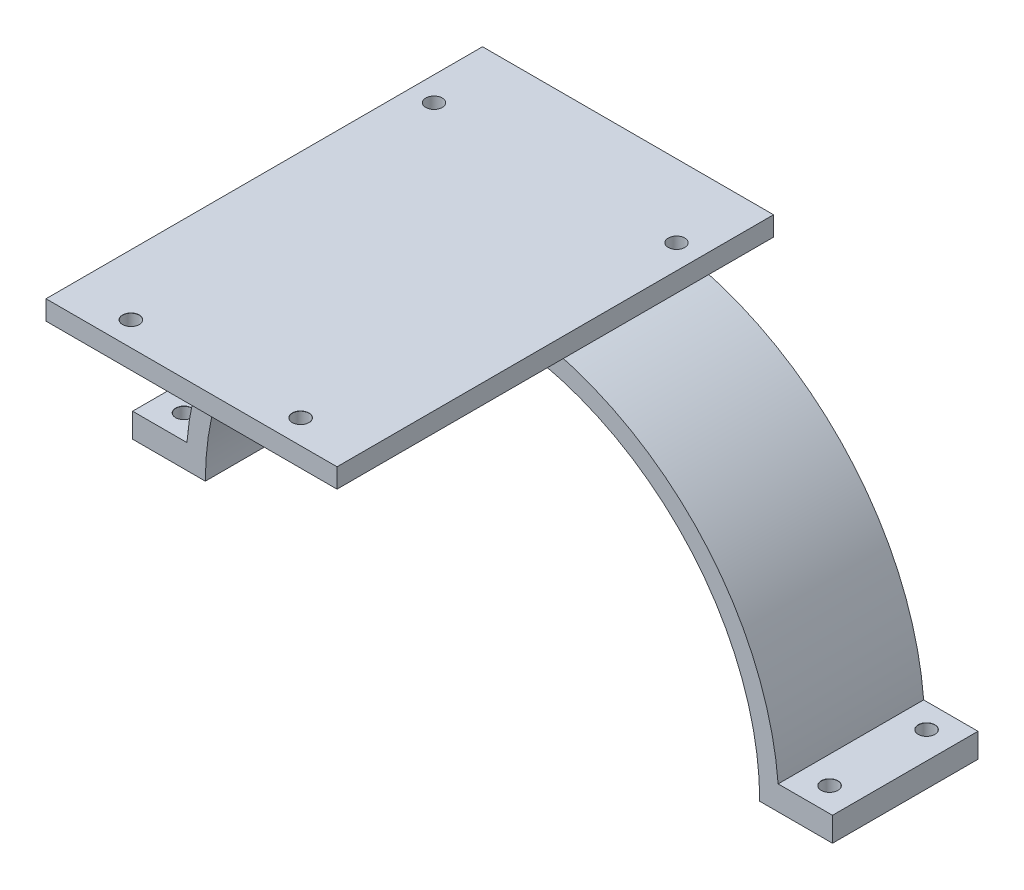
ISO-10303-21;
HEADER;
FILE_DESCRIPTION(('STEP AP214'),'2;1');
FILE_NAME('part.step','',(''),(''),'','','');
FILE_SCHEMA(('AUTOMOTIVE_DESIGN { 1 0 10303 214 1 1 1 1 }'));
ENDSEC;
DATA;
#1=APPLICATION_CONTEXT('core data for automotive mechanical design processes');
#2=APPLICATION_PROTOCOL_DEFINITION('international standard','automotive_design',2000,#1);
#3=PRODUCT_CONTEXT('',#1,'mechanical');
#4=PRODUCT('Part','Part','',(#3));
#5=PRODUCT_RELATED_PRODUCT_CATEGORY('part','',(#4));
#6=PRODUCT_DEFINITION_FORMATION('','',#4);
#7=PRODUCT_DEFINITION_CONTEXT('part definition',#1,'design');
#8=PRODUCT_DEFINITION('design','',#6,#7);
#9=PRODUCT_DEFINITION_SHAPE('','',#8);
#10=(LENGTH_UNIT() NAMED_UNIT(*) SI_UNIT(.MILLI.,.METRE.));
#11=(NAMED_UNIT(*) PLANE_ANGLE_UNIT() SI_UNIT($,.RADIAN.));
#12=(NAMED_UNIT(*) SI_UNIT($,.STERADIAN.) SOLID_ANGLE_UNIT());
#13=UNCERTAINTY_MEASURE_WITH_UNIT(LENGTH_MEASURE(1.E-05),#10,'distance_accuracy_value','');
#14=(GEOMETRIC_REPRESENTATION_CONTEXT(3) GLOBAL_UNCERTAINTY_ASSIGNED_CONTEXT((#13)) GLOBAL_UNIT_ASSIGNED_CONTEXT((#10,
#11,#12)) REPRESENTATION_CONTEXT('',''));
#15=CARTESIAN_POINT('',(0.,0.,0.));
#16=DIRECTION('',(0.,0.,1.));
#17=DIRECTION('',(1.,0.,0.));
#18=AXIS2_PLACEMENT_3D('',#15,#16,#17);
#19=CARTESIAN_POINT('',(0.,0.,30.));
#20=DIRECTION('',(0.,0.,-1.));
#21=DIRECTION('',(-1.,0.,0.));
#22=AXIS2_PLACEMENT_3D('',#19,#20,#21);
#23=CYLINDRICAL_SURFACE('',#22,61.15);
#24=CARTESIAN_POINT('',(0.,0.,30.));
#25=DIRECTION('',(0.,0.,1.));
#26=DIRECTION('',(-1.,0.,0.));
#27=AXIS2_PLACEMENT_3D('',#24,#25,#26);
#28=CIRCLE('',#27,61.15);
#29=CARTESIAN_POINT('',(-15.,59.2817214662327,30.));
#30=VERTEX_POINT('',#29);
#31=CARTESIAN_POINT('',(-60.9452418159121,5.,30.));
#32=VERTEX_POINT('',#31);
#33=EDGE_CURVE('E373',#30,#32,#28,.T.);
#34=ORIENTED_EDGE('',*,*,#33,.F.);
#35=DIRECTION('',(0.,0.,-1.));
#36=VECTOR('',#35,1.);
#37=CARTESIAN_POINT('',(-15.,59.2817214662327,30.));
#38=LINE('',#37,#36);
#39=CARTESIAN_POINT('',(-15.,59.2817214662327,0.));
#40=VERTEX_POINT('',#39);
#41=EDGE_CURVE('E261',#30,#40,#38,.T.);
#42=ORIENTED_EDGE('',*,*,#41,.T.);
#43=CARTESIAN_POINT('',(0.,0.,0.));
#44=DIRECTION('',(0.,0.,1.));
#45=DIRECTION('',(-1.,0.,0.));
#46=AXIS2_PLACEMENT_3D('',#43,#44,#45);
#47=CIRCLE('',#46,61.15);
#48=CARTESIAN_POINT('',(-60.9452418159121,5.,0.));
#49=VERTEX_POINT('',#48);
#50=EDGE_CURVE('E385',#40,#49,#47,.T.);
#51=ORIENTED_EDGE('',*,*,#50,.T.);
#52=DIRECTION('',(0.,0.,-1.));
#53=VECTOR('',#52,1.);
#54=CARTESIAN_POINT('',(-60.9452418159121,5.,30.));
#55=LINE('',#54,#53);
#56=EDGE_CURVE('E358',#49,#32,#55,.F.);
#57=ORIENTED_EDGE('',*,*,#56,.T.);
#58=EDGE_LOOP('',(#34,#42,#51,#57));
#59=FACE_BOUND('',#58,.T.);
#60=ADVANCED_FACE('F43',(#59),#23,.T.);
#61=CARTESIAN_POINT('',(0.,0.,30.));
#62=DIRECTION('',(0.,0.,-1.));
#63=DIRECTION('',(-1.,0.,0.));
#64=AXIS2_PLACEMENT_3D('',#61,#62,#63);
#65=CYLINDRICAL_SURFACE('',#64,57.15);
#66=CARTESIAN_POINT('',(0.,0.,0.));
#67=DIRECTION('',(0.,0.,-1.));
#68=DIRECTION('',(-1.,0.,0.));
#69=AXIS2_PLACEMENT_3D('',#66,#67,#68);
#70=CIRCLE('',#69,57.15);
#71=CARTESIAN_POINT('',(-57.15,0.,0.));
#72=VERTEX_POINT('',#71);
#73=CARTESIAN_POINT('',(57.15,0.,0.));
#74=VERTEX_POINT('',#73);
#75=EDGE_CURVE('E365',#72,#74,#70,.T.);
#76=ORIENTED_EDGE('',*,*,#75,.T.);
#77=DIRECTION('',(0.,0.,-1.));
#78=VECTOR('',#77,1.);
#79=CARTESIAN_POINT('',(57.15,0.,30.));
#80=LINE('',#79,#78);
#81=CARTESIAN_POINT('',(57.15,0.,30.));
#82=VERTEX_POINT('',#81);
#83=EDGE_CURVE('E53',#82,#74,#80,.T.);
#84=ORIENTED_EDGE('',*,*,#83,.F.);
#85=CARTESIAN_POINT('',(0.,0.,30.));
#86=DIRECTION('',(0.,0.,-1.));
#87=DIRECTION('',(-1.,0.,0.));
#88=AXIS2_PLACEMENT_3D('',#85,#86,#87);
#89=CIRCLE('',#88,57.15);
#90=CARTESIAN_POINT('',(-57.15,0.,30.));
#91=VERTEX_POINT('',#90);
#92=EDGE_CURVE('E366',#91,#82,#89,.T.);
#93=ORIENTED_EDGE('',*,*,#92,.F.);
#94=DIRECTION('',(0.,0.,-1.));
#95=VECTOR('',#94,1.);
#96=CARTESIAN_POINT('',(-57.15,0.,30.));
#97=LINE('',#96,#95);
#98=EDGE_CURVE('E379',#91,#72,#97,.T.);
#99=ORIENTED_EDGE('',*,*,#98,.T.);
#100=EDGE_LOOP('',(#76,#84,#93,#99));
#101=FACE_BOUND('',#100,.T.);
#102=ADVANCED_FACE('F45',(#101),#65,.F.);
#103=CARTESIAN_POINT('',(57.15,0.,30.));
#104=DIRECTION('',(0.,1.,0.));
#105=DIRECTION('',(0.,0.,1.));
#106=AXIS2_PLACEMENT_3D('',#103,#104,#105);
#107=PLANE('',#106);
#108=CARTESIAN_POINT('',(66.547620907956,0.,4.99999999999998));
#109=DIRECTION('',(0.,1.,0.));
#110=DIRECTION('',(0.,0.,1.));
#111=AXIS2_PLACEMENT_3D('',#108,#109,#110);
#112=CIRCLE('',#111,1.69999999999999);
#113=CARTESIAN_POINT('',(66.547620907956,0.,6.69999999999998));
#114=VERTEX_POINT('',#113);
#115=EDGE_CURVE('E297',#114,#114,#112,.T.);
#116=ORIENTED_EDGE('',*,*,#115,.T.);
#117=EDGE_LOOP('',(#116));
#118=FACE_BOUND('',#117,.T.);
#119=CARTESIAN_POINT('',(66.547620907956,0.,25.));
#120=DIRECTION('',(0.,1.,0.));
#121=DIRECTION('',(0.,0.,1.));
#122=AXIS2_PLACEMENT_3D('',#119,#120,#121);
#123=CIRCLE('',#122,1.69999999999999);
#124=CARTESIAN_POINT('',(66.547620907956,0.,26.7));
#125=VERTEX_POINT('',#124);
#126=EDGE_CURVE('E309',#125,#125,#123,.T.);
#127=ORIENTED_EDGE('',*,*,#126,.T.);
#128=EDGE_LOOP('',(#127));
#129=FACE_BOUND('',#128,.T.);
#130=DIRECTION('',(1.,0.,0.));
#131=VECTOR('',#130,1.);
#132=CARTESIAN_POINT('',(57.15,0.,0.));
#133=LINE('',#132,#131);
#134=CARTESIAN_POINT('',(72.15,0.,0.));
#135=VERTEX_POINT('',#134);
#136=EDGE_CURVE('E382',#74,#135,#133,.T.);
#137=ORIENTED_EDGE('',*,*,#136,.T.);
#138=DIRECTION('',(0.,0.,1.));
#139=VECTOR('',#138,1.);
#140=CARTESIAN_POINT('',(72.15,0.,-15.8113883008419));
#141=LINE('',#140,#139);
#142=CARTESIAN_POINT('',(72.15,0.,30.));
#143=VERTEX_POINT('',#142);
#144=EDGE_CURVE('E313',#135,#143,#141,.T.);
#145=ORIENTED_EDGE('',*,*,#144,.T.);
#146=DIRECTION('',(1.,0.,0.));
#147=VECTOR('',#146,1.);
#148=CARTESIAN_POINT('',(57.15,0.,30.));
#149=LINE('',#148,#147);
#150=EDGE_CURVE('E369',#82,#143,#149,.T.);
#151=ORIENTED_EDGE('',*,*,#150,.F.);
#152=ORIENTED_EDGE('',*,*,#83,.T.);
#153=EDGE_LOOP('',(#137,#145,#151,#152));
#154=FACE_BOUND('',#153,.T.);
#155=ADVANCED_FACE('F470',(#118,#129,#154),#107,.F.);
#156=CARTESIAN_POINT('',(60.9452418159121,5.,0.));
#157=VERTEX_POINT('',#156);
#158=CARTESIAN_POINT('',(15.,59.2817214662327,0.));
#159=VERTEX_POINT('',#158);
#160=EDGE_CURVE('E386',#157,#159,#47,.T.);
#161=ORIENTED_EDGE('',*,*,#160,.T.);
#162=DIRECTION('',(0.,0.,-1.));
#163=VECTOR('',#162,1.);
#164=CARTESIAN_POINT('',(15.,59.2817214662327,30.));
#165=LINE('',#164,#163);
#166=CARTESIAN_POINT('',(15.,59.2817214662327,30.));
#167=VERTEX_POINT('',#166);
#168=EDGE_CURVE('E258',#159,#167,#165,.F.);
#169=ORIENTED_EDGE('',*,*,#168,.T.);
#170=CARTESIAN_POINT('',(60.9452418159121,5.,30.));
#171=VERTEX_POINT('',#170);
#172=EDGE_CURVE('E68',#171,#167,#28,.T.);
#173=ORIENTED_EDGE('',*,*,#172,.F.);
#174=DIRECTION('',(0.,0.,-1.));
#175=VECTOR('',#174,1.);
#176=CARTESIAN_POINT('',(60.9452418159121,5.,30.));
#177=LINE('',#176,#175);
#178=EDGE_CURVE('E333',#171,#157,#177,.T.);
#179=ORIENTED_EDGE('',*,*,#178,.T.);
#180=EDGE_LOOP('',(#161,#169,#173,#179));
#181=FACE_BOUND('',#180,.T.);
#182=ADVANCED_FACE('F481',(#181),#23,.T.);
#183=CARTESIAN_POINT('',(-57.15,0.,30.));
#184=DIRECTION('',(0.,1.,0.));
#185=DIRECTION('',(-1.,0.,0.));
#186=AXIS2_PLACEMENT_3D('',#183,#184,#185);
#187=PLANE('',#186);
#188=CARTESIAN_POINT('',(-66.547620907956,0.,5.));
#189=DIRECTION('',(0.,1.,0.));
#190=DIRECTION('',(0.,0.,1.));
#191=AXIS2_PLACEMENT_3D('',#188,#189,#190);
#192=CIRCLE('',#191,1.69999999999999);
#193=CARTESIAN_POINT('',(-66.547620907956,0.,6.69999999999999));
#194=VERTEX_POINT('',#193);
#195=EDGE_CURVE('E273',#194,#194,#192,.T.);
#196=ORIENTED_EDGE('',*,*,#195,.T.);
#197=EDGE_LOOP('',(#196));
#198=FACE_BOUND('',#197,.T.);
#199=CARTESIAN_POINT('',(-66.547620907956,0.,25.));
#200=DIRECTION('',(0.,1.,0.));
#201=DIRECTION('',(0.,0.,1.));
#202=AXIS2_PLACEMENT_3D('',#199,#200,#201);
#203=CIRCLE('',#202,1.69999999999999);
#204=CARTESIAN_POINT('',(-66.547620907956,0.,26.7));
#205=VERTEX_POINT('',#204);
#206=EDGE_CURVE('E285',#205,#205,#203,.T.);
#207=ORIENTED_EDGE('',*,*,#206,.T.);
#208=EDGE_LOOP('',(#207));
#209=FACE_BOUND('',#208,.T.);
#210=DIRECTION('',(1.,0.,0.));
#211=VECTOR('',#210,1.);
#212=CARTESIAN_POINT('',(-57.15,0.,0.));
#213=LINE('',#212,#211);
#214=CARTESIAN_POINT('',(-72.15,0.,0.));
#215=VERTEX_POINT('',#214);
#216=EDGE_CURVE('E370',#215,#72,#213,.T.);
#217=ORIENTED_EDGE('',*,*,#216,.T.);
#218=ORIENTED_EDGE('',*,*,#98,.F.);
#219=DIRECTION('',(1.,0.,0.));
#220=VECTOR('',#219,1.);
#221=CARTESIAN_POINT('',(-57.15,0.,30.));
#222=LINE('',#221,#220);
#223=CARTESIAN_POINT('',(-72.15,0.,30.));
#224=VERTEX_POINT('',#223);
#225=EDGE_CURVE('E376',#224,#91,#222,.T.);
#226=ORIENTED_EDGE('',*,*,#225,.F.);
#227=DIRECTION('',(0.,0.,1.));
#228=VECTOR('',#227,1.);
#229=CARTESIAN_POINT('',(-72.15,0.,-15.8113883008419));
#230=LINE('',#229,#228);
#231=EDGE_CURVE('E354',#215,#224,#230,.T.);
#232=ORIENTED_EDGE('',*,*,#231,.F.);
#233=EDGE_LOOP('',(#217,#218,#226,#232));
#234=FACE_BOUND('',#233,.T.);
#235=ADVANCED_FACE('F465',(#198,#209,#234),#187,.F.);
#236=CARTESIAN_POINT('',(0.,0.,30.));
#237=DIRECTION('',(0.,0.,-1.));
#238=DIRECTION('',(-1.,0.,0.));
#239=AXIS2_PLACEMENT_3D('',#236,#237,#238);
#240=PLANE('',#239);
#241=DIRECTION('',(0.,1.,0.));
#242=VECTOR('',#241,1.);
#243=CARTESIAN_POINT('',(15.,57.15,30.));
#244=LINE('',#243,#242);
#245=CARTESIAN_POINT('',(15.,72.15,30.));
#246=VERTEX_POINT('',#245);
#247=EDGE_CURVE('E61',#167,#246,#244,.T.);
#248=ORIENTED_EDGE('',*,*,#247,.T.);
#249=DIRECTION('',(-1.,0.,0.));
#250=VECTOR('',#249,1.);
#251=CARTESIAN_POINT('',(-30.,72.15,30.));
#252=LINE('',#251,#250);
#253=CARTESIAN_POINT('',(-15.,72.15,30.));
#254=VERTEX_POINT('',#253);
#255=EDGE_CURVE('E11',#246,#254,#252,.T.);
#256=ORIENTED_EDGE('',*,*,#255,.T.);
#257=DIRECTION('',(0.,-1.,0.));
#258=VECTOR('',#257,1.);
#259=CARTESIAN_POINT('',(-15.,57.15,30.));
#260=LINE('',#259,#258);
#261=EDGE_CURVE('E204',#254,#30,#260,.T.);
#262=ORIENTED_EDGE('',*,*,#261,.T.);
#263=ORIENTED_EDGE('',*,*,#33,.T.);
#264=DIRECTION('',(-1.,0.,0.));
#265=VECTOR('',#264,1.);
#266=CARTESIAN_POINT('',(-57.15,5.,30.));
#267=LINE('',#266,#265);
#268=CARTESIAN_POINT('',(-72.15,5.,30.));
#269=VERTEX_POINT('',#268);
#270=EDGE_CURVE('E339',#32,#269,#267,.T.);
#271=ORIENTED_EDGE('',*,*,#270,.T.);
#272=DIRECTION('',(0.,-1.,0.));
#273=VECTOR('',#272,1.);
#274=CARTESIAN_POINT('',(-72.15,0.,30.));
#275=LINE('',#274,#273);
#276=EDGE_CURVE('E340',#269,#224,#275,.T.);
#277=ORIENTED_EDGE('',*,*,#276,.T.);
#278=ORIENTED_EDGE('',*,*,#225,.T.);
#279=ORIENTED_EDGE('',*,*,#92,.T.);
#280=ORIENTED_EDGE('',*,*,#150,.T.);
#281=DIRECTION('',(0.,1.,0.));
#282=VECTOR('',#281,1.);
#283=CARTESIAN_POINT('',(72.15,0.,30.));
#284=LINE('',#283,#282);
#285=CARTESIAN_POINT('',(72.15,5.,30.));
#286=VERTEX_POINT('',#285);
#287=EDGE_CURVE('E329',#143,#286,#284,.T.);
#288=ORIENTED_EDGE('',*,*,#287,.T.);
#289=DIRECTION('',(-1.,0.,0.));
#290=VECTOR('',#289,1.);
#291=CARTESIAN_POINT('',(57.15,5.,30.));
#292=LINE('',#291,#290);
#293=EDGE_CURVE('E328',#286,#171,#292,.T.);
#294=ORIENTED_EDGE('',*,*,#293,.T.);
#295=ORIENTED_EDGE('',*,*,#172,.T.);
#296=EDGE_LOOP('',(#248,#256,#262,#263,#271,#277,#278,#279,#280,#288,#294,#295));
#297=FACE_BOUND('',#296,.T.);
#298=ADVANCED_FACE('F445',(#297),#240,.F.);
#299=CARTESIAN_POINT('',(0.,0.,0.));
#300=DIRECTION('',(0.,0.,-1.));
#301=DIRECTION('',(-1.,0.,0.));
#302=AXIS2_PLACEMENT_3D('',#299,#300,#301);
#303=PLANE('',#302);
#304=ORIENTED_EDGE('',*,*,#50,.F.);
#305=DIRECTION('',(0.,-1.,0.));
#306=VECTOR('',#305,1.);
#307=CARTESIAN_POINT('',(-15.,57.15,0.));
#308=LINE('',#307,#306);
#309=CARTESIAN_POINT('',(-15.,72.15,0.));
#310=VERTEX_POINT('',#309);
#311=EDGE_CURVE('E218',#310,#40,#308,.T.);
#312=ORIENTED_EDGE('',*,*,#311,.F.);
#313=DIRECTION('',(1.,0.,0.));
#314=VECTOR('',#313,1.);
#315=CARTESIAN_POINT('',(-15.,72.15,0.));
#316=LINE('',#315,#314);
#317=CARTESIAN_POINT('',(-30.,72.15,0.));
#318=VERTEX_POINT('',#317);
#319=EDGE_CURVE('E225',#318,#310,#316,.T.);
#320=ORIENTED_EDGE('',*,*,#319,.F.);
#321=DIRECTION('',(0.,-1.,0.));
#322=VECTOR('',#321,1.);
#323=CARTESIAN_POINT('',(-30.,72.15,0.));
#324=LINE('',#323,#322);
#325=CARTESIAN_POINT('',(-30.,76.15,0.));
#326=VERTEX_POINT('',#325);
#327=EDGE_CURVE('E231',#326,#318,#324,.T.);
#328=ORIENTED_EDGE('',*,*,#327,.F.);
#329=DIRECTION('',(-1.,0.,0.));
#330=VECTOR('',#329,1.);
#331=CARTESIAN_POINT('',(30.,76.15,0.));
#332=LINE('',#331,#330);
#333=CARTESIAN_POINT('',(30.,76.15,0.));
#334=VERTEX_POINT('',#333);
#335=EDGE_CURVE('E236',#334,#326,#332,.T.);
#336=ORIENTED_EDGE('',*,*,#335,.F.);
#337=DIRECTION('',(0.,1.,0.));
#338=VECTOR('',#337,1.);
#339=CARTESIAN_POINT('',(30.,72.15,0.));
#340=LINE('',#339,#338);
#341=CARTESIAN_POINT('',(30.,72.15,0.));
#342=VERTEX_POINT('',#341);
#343=EDGE_CURVE('E174',#342,#334,#340,.T.);
#344=ORIENTED_EDGE('',*,*,#343,.F.);
#345=DIRECTION('',(1.,0.,0.));
#346=VECTOR('',#345,1.);
#347=CARTESIAN_POINT('',(15.,72.15,0.));
#348=LINE('',#347,#346);
#349=CARTESIAN_POINT('',(15.,72.15,0.));
#350=VERTEX_POINT('',#349);
#351=EDGE_CURVE('E170',#350,#342,#348,.T.);
#352=ORIENTED_EDGE('',*,*,#351,.F.);
#353=DIRECTION('',(0.,1.,0.));
#354=VECTOR('',#353,1.);
#355=CARTESIAN_POINT('',(15.,57.15,0.));
#356=LINE('',#355,#354);
#357=EDGE_CURVE('E224',#159,#350,#356,.T.);
#358=ORIENTED_EDGE('',*,*,#357,.F.);
#359=ORIENTED_EDGE('',*,*,#160,.F.);
#360=DIRECTION('',(-1.,0.,0.));
#361=VECTOR('',#360,1.);
#362=CARTESIAN_POINT('',(57.15,5.,0.));
#363=LINE('',#362,#361);
#364=CARTESIAN_POINT('',(72.15,5.,0.));
#365=VERTEX_POINT('',#364);
#366=EDGE_CURVE('E317',#365,#157,#363,.T.);
#367=ORIENTED_EDGE('',*,*,#366,.F.);
#368=DIRECTION('',(0.,1.,0.));
#369=VECTOR('',#368,1.);
#370=CARTESIAN_POINT('',(72.15,0.,0.));
#371=LINE('',#370,#369);
#372=EDGE_CURVE('E321',#135,#365,#371,.T.);
#373=ORIENTED_EDGE('',*,*,#372,.F.);
#374=ORIENTED_EDGE('',*,*,#136,.F.);
#375=ORIENTED_EDGE('',*,*,#75,.F.);
#376=ORIENTED_EDGE('',*,*,#216,.F.);
#377=DIRECTION('',(0.,-1.,0.));
#378=VECTOR('',#377,1.);
#379=CARTESIAN_POINT('',(-72.15,0.,0.));
#380=LINE('',#379,#378);
#381=CARTESIAN_POINT('',(-72.15,5.,0.));
#382=VERTEX_POINT('',#381);
#383=EDGE_CURVE('E350',#382,#215,#380,.T.);
#384=ORIENTED_EDGE('',*,*,#383,.F.);
#385=DIRECTION('',(-1.,0.,0.));
#386=VECTOR('',#385,1.);
#387=CARTESIAN_POINT('',(-57.15,5.,0.));
#388=LINE('',#387,#386);
#389=EDGE_CURVE('E344',#49,#382,#388,.T.);
#390=ORIENTED_EDGE('',*,*,#389,.F.);
#391=EDGE_LOOP('',(#304,#312,#320,#328,#336,#344,#352,#358,#359,#367,#373,#374,#375,#376,#384,#390));
#392=FACE_BOUND('',#391,.T.);
#393=ADVANCED_FACE('F435',(#392),#303,.T.);
#394=CARTESIAN_POINT('',(-57.15,5.,-15.8113883008419));
#395=DIRECTION('',(0.,1.,0.));
#396=DIRECTION('',(-1.,0.,0.));
#397=AXIS2_PLACEMENT_3D('',#394,#395,#396);
#398=PLANE('',#397);
#399=CARTESIAN_POINT('',(-66.547620907956,5.00000000000003,5.));
#400=DIRECTION('',(0.,1.,0.));
#401=DIRECTION('',(0.,0.,1.));
#402=AXIS2_PLACEMENT_3D('',#399,#400,#401);
#403=CIRCLE('',#402,1.725);
#404=CARTESIAN_POINT('',(-66.547620907956,5.00000000000003,6.725));
#405=VERTEX_POINT('',#404);
#406=EDGE_CURVE('E265',#405,#405,#403,.T.);
#407=ORIENTED_EDGE('',*,*,#406,.F.);
#408=EDGE_LOOP('',(#407));
#409=FACE_BOUND('',#408,.T.);
#410=CARTESIAN_POINT('',(-66.547620907956,5.00000000000003,25.));
#411=DIRECTION('',(0.,1.,0.));
#412=DIRECTION('',(0.,0.,1.));
#413=AXIS2_PLACEMENT_3D('',#410,#411,#412);
#414=CIRCLE('',#413,1.725);
#415=CARTESIAN_POINT('',(-66.547620907956,5.00000000000003,26.725));
#416=VERTEX_POINT('',#415);
#417=EDGE_CURVE('E277',#416,#416,#414,.T.);
#418=ORIENTED_EDGE('',*,*,#417,.F.);
#419=EDGE_LOOP('',(#418));
#420=FACE_BOUND('',#419,.T.);
#421=ORIENTED_EDGE('',*,*,#56,.F.);
#422=ORIENTED_EDGE('',*,*,#389,.T.);
#423=DIRECTION('',(0.,0.,1.));
#424=VECTOR('',#423,1.);
#425=CARTESIAN_POINT('',(-72.15,5.,-15.8113883008419));
#426=LINE('',#425,#424);
#427=EDGE_CURVE('E349',#382,#269,#426,.T.);
#428=ORIENTED_EDGE('',*,*,#427,.T.);
#429=ORIENTED_EDGE('',*,*,#270,.F.);
#430=EDGE_LOOP('',(#421,#422,#428,#429));
#431=FACE_BOUND('',#430,.T.);
#432=ADVANCED_FACE('F453',(#409,#420,#431),#398,.T.);
#433=CARTESIAN_POINT('',(-72.15,0.,-15.8113883008419));
#434=DIRECTION('',(-1.,0.,0.));
#435=DIRECTION('',(0.,0.,1.));
#436=AXIS2_PLACEMENT_3D('',#433,#434,#435);
#437=PLANE('',#436);
#438=ORIENTED_EDGE('',*,*,#427,.F.);
#439=ORIENTED_EDGE('',*,*,#383,.T.);
#440=ORIENTED_EDGE('',*,*,#231,.T.);
#441=ORIENTED_EDGE('',*,*,#276,.F.);
#442=EDGE_LOOP('',(#438,#439,#440,#441));
#443=FACE_BOUND('',#442,.T.);
#444=ADVANCED_FACE('F460',(#443),#437,.T.);
#445=CARTESIAN_POINT('',(57.15,5.,-15.8113883008419));
#446=DIRECTION('',(0.,1.,0.));
#447=DIRECTION('',(-1.,0.,0.));
#448=AXIS2_PLACEMENT_3D('',#445,#446,#447);
#449=PLANE('',#448);
#450=CARTESIAN_POINT('',(66.547620907956,5.,4.99999999999998));
#451=DIRECTION('',(0.,1.,0.));
#452=DIRECTION('',(0.,0.,1.));
#453=AXIS2_PLACEMENT_3D('',#450,#451,#452);
#454=CIRCLE('',#453,1.725);
#455=CARTESIAN_POINT('',(66.547620907956,5.,6.72499999999999));
#456=VERTEX_POINT('',#455);
#457=EDGE_CURVE('E289',#456,#456,#454,.T.);
#458=ORIENTED_EDGE('',*,*,#457,.F.);
#459=EDGE_LOOP('',(#458));
#460=FACE_BOUND('',#459,.T.);
#461=CARTESIAN_POINT('',(66.547620907956,5.,25.));
#462=DIRECTION('',(0.,1.,0.));
#463=DIRECTION('',(0.,0.,1.));
#464=AXIS2_PLACEMENT_3D('',#461,#462,#463);
#465=CIRCLE('',#464,1.725);
#466=CARTESIAN_POINT('',(66.547620907956,5.,26.725));
#467=VERTEX_POINT('',#466);
#468=EDGE_CURVE('E301',#467,#467,#465,.T.);
#469=ORIENTED_EDGE('',*,*,#468,.F.);
#470=EDGE_LOOP('',(#469));
#471=FACE_BOUND('',#470,.T.);
#472=ORIENTED_EDGE('',*,*,#178,.F.);
#473=ORIENTED_EDGE('',*,*,#293,.F.);
#474=DIRECTION('',(0.,0.,1.));
#475=VECTOR('',#474,1.);
#476=CARTESIAN_POINT('',(72.15,5.,-15.8113883008419));
#477=LINE('',#476,#475);
#478=EDGE_CURVE('E318',#365,#286,#477,.T.);
#479=ORIENTED_EDGE('',*,*,#478,.F.);
#480=ORIENTED_EDGE('',*,*,#366,.T.);
#481=EDGE_LOOP('',(#472,#473,#479,#480));
#482=FACE_BOUND('',#481,.T.);
#483=ADVANCED_FACE('F479',(#460,#471,#482),#449,.T.);
#484=CARTESIAN_POINT('',(72.15,0.,-15.8113883008419));
#485=DIRECTION('',(1.,0.,0.));
#486=DIRECTION('',(0.,0.,-1.));
#487=AXIS2_PLACEMENT_3D('',#484,#485,#486);
#488=PLANE('',#487);
#489=ORIENTED_EDGE('',*,*,#144,.F.);
#490=ORIENTED_EDGE('',*,*,#372,.T.);
#491=ORIENTED_EDGE('',*,*,#478,.T.);
#492=ORIENTED_EDGE('',*,*,#287,.F.);
#493=EDGE_LOOP('',(#489,#490,#491,#492));
#494=FACE_BOUND('',#493,.T.);
#495=ADVANCED_FACE('F476',(#494),#488,.T.);
#496=CARTESIAN_POINT('',(66.547620907956,5.,25.));
#497=DIRECTION('',(0.,1.,0.));
#498=DIRECTION('',(0.,0.,1.));
#499=AXIS2_PLACEMENT_3D('',#496,#497,#498);
#500=CYLINDRICAL_SURFACE('',#499,1.69999999999999);
#501=ORIENTED_EDGE('',*,*,#126,.F.);
#502=EDGE_LOOP('',(#501));
#503=FACE_BOUND('',#502,.T.);
#504=CARTESIAN_POINT('',(66.547620907956,4.97124078981947,25.));
#505=DIRECTION('',(0.,1.,0.));
#506=DIRECTION('',(0.,0.,1.));
#507=AXIS2_PLACEMENT_3D('',#504,#505,#506);
#508=CIRCLE('',#507,1.69999999999999);
#509=CARTESIAN_POINT('',(66.547620907956,4.97124078981947,26.7));
#510=VERTEX_POINT('',#509);
#511=EDGE_CURVE('E305',#510,#510,#508,.T.);
#512=ORIENTED_EDGE('',*,*,#511,.T.);
#513=EDGE_LOOP('',(#512));
#514=FACE_BOUND('',#513,.T.);
#515=ADVANCED_FACE('F512',(#503,#514),#500,.F.);
#516=CARTESIAN_POINT('',(66.547620907956,5.,25.));
#517=DIRECTION('',(0.,1.,0.));
#518=DIRECTION('',(0.,0.,1.));
#519=AXIS2_PLACEMENT_3D('',#516,#517,#518);
#520=CONICAL_SURFACE('',#519,1.725,0.715584993317802);
#521=ORIENTED_EDGE('',*,*,#511,.F.);
#522=EDGE_LOOP('',(#521));
#523=FACE_BOUND('',#522,.T.);
#524=ORIENTED_EDGE('',*,*,#468,.T.);
#525=EDGE_LOOP('',(#524));
#526=FACE_BOUND('',#525,.T.);
#527=ADVANCED_FACE('F515',(#523,#526),#520,.F.);
#528=CARTESIAN_POINT('',(66.547620907956,5.,4.99999999999998));
#529=DIRECTION('',(0.,1.,0.));
#530=DIRECTION('',(0.,0.,1.));
#531=AXIS2_PLACEMENT_3D('',#528,#529,#530);
#532=CYLINDRICAL_SURFACE('',#531,1.69999999999999);
#533=ORIENTED_EDGE('',*,*,#115,.F.);
#534=EDGE_LOOP('',(#533));
#535=FACE_BOUND('',#534,.T.);
#536=CARTESIAN_POINT('',(66.547620907956,4.97124078981947,4.99999999999998));
#537=DIRECTION('',(0.,1.,0.));
#538=DIRECTION('',(0.,0.,1.));
#539=AXIS2_PLACEMENT_3D('',#536,#537,#538);
#540=CIRCLE('',#539,1.69999999999999);
#541=CARTESIAN_POINT('',(66.547620907956,4.97124078981947,6.69999999999998));
#542=VERTEX_POINT('',#541);
#543=EDGE_CURVE('E293',#542,#542,#540,.T.);
#544=ORIENTED_EDGE('',*,*,#543,.T.);
#545=EDGE_LOOP('',(#544));
#546=FACE_BOUND('',#545,.T.);
#547=ADVANCED_FACE('F521',(#535,#546),#532,.F.);
#548=CARTESIAN_POINT('',(66.547620907956,5.,4.99999999999998));
#549=DIRECTION('',(0.,1.,0.));
#550=DIRECTION('',(0.,0.,1.));
#551=AXIS2_PLACEMENT_3D('',#548,#549,#550);
#552=CONICAL_SURFACE('',#551,1.725,0.715584993317802);
#553=ORIENTED_EDGE('',*,*,#543,.F.);
#554=EDGE_LOOP('',(#553));
#555=FACE_BOUND('',#554,.T.);
#556=ORIENTED_EDGE('',*,*,#457,.T.);
#557=EDGE_LOOP('',(#556));
#558=FACE_BOUND('',#557,.T.);
#559=ADVANCED_FACE('F639',(#555,#558),#552,.F.);
#560=CARTESIAN_POINT('',(-66.547620907956,5.00000000000003,25.));
#561=DIRECTION('',(0.,1.,0.));
#562=DIRECTION('',(0.,0.,1.));
#563=AXIS2_PLACEMENT_3D('',#560,#561,#562);
#564=CYLINDRICAL_SURFACE('',#563,1.69999999999999);
#565=ORIENTED_EDGE('',*,*,#206,.F.);
#566=EDGE_LOOP('',(#565));
#567=FACE_BOUND('',#566,.T.);
#568=CARTESIAN_POINT('',(-66.547620907956,4.9712407898195,25.));
#569=DIRECTION('',(0.,1.,0.));
#570=DIRECTION('',(0.,0.,1.));
#571=AXIS2_PLACEMENT_3D('',#568,#569,#570);
#572=CIRCLE('',#571,1.69999999999999);
#573=CARTESIAN_POINT('',(-66.547620907956,4.9712407898195,26.7));
#574=VERTEX_POINT('',#573);
#575=EDGE_CURVE('E281',#574,#574,#572,.T.);
#576=ORIENTED_EDGE('',*,*,#575,.T.);
#577=EDGE_LOOP('',(#576));
#578=FACE_BOUND('',#577,.T.);
#579=ADVANCED_FACE('F649',(#567,#578),#564,.F.);
#580=CARTESIAN_POINT('',(-66.547620907956,5.00000000000003,25.));
#581=DIRECTION('',(0.,1.,0.));
#582=DIRECTION('',(0.,0.,1.));
#583=AXIS2_PLACEMENT_3D('',#580,#581,#582);
#584=CONICAL_SURFACE('',#583,1.725,0.715584993317802);
#585=ORIENTED_EDGE('',*,*,#575,.F.);
#586=EDGE_LOOP('',(#585));
#587=FACE_BOUND('',#586,.T.);
#588=ORIENTED_EDGE('',*,*,#417,.T.);
#589=EDGE_LOOP('',(#588));
#590=FACE_BOUND('',#589,.T.);
#591=ADVANCED_FACE('F659',(#587,#590),#584,.F.);
#592=CARTESIAN_POINT('',(-66.547620907956,5.00000000000003,5.));
#593=DIRECTION('',(0.,1.,0.));
#594=DIRECTION('',(0.,0.,1.));
#595=AXIS2_PLACEMENT_3D('',#592,#593,#594);
#596=CYLINDRICAL_SURFACE('',#595,1.69999999999999);
#597=ORIENTED_EDGE('',*,*,#195,.F.);
#598=EDGE_LOOP('',(#597));
#599=FACE_BOUND('',#598,.T.);
#600=CARTESIAN_POINT('',(-66.547620907956,4.9712407898195,5.));
#601=DIRECTION('',(0.,1.,0.));
#602=DIRECTION('',(0.,0.,1.));
#603=AXIS2_PLACEMENT_3D('',#600,#601,#602);
#604=CIRCLE('',#603,1.69999999999999);
#605=CARTESIAN_POINT('',(-66.547620907956,4.9712407898195,6.69999999999999));
#606=VERTEX_POINT('',#605);
#607=EDGE_CURVE('E269',#606,#606,#604,.T.);
#608=ORIENTED_EDGE('',*,*,#607,.T.);
#609=EDGE_LOOP('',(#608));
#610=FACE_BOUND('',#609,.T.);
#611=ADVANCED_FACE('F669',(#599,#610),#596,.F.);
#612=CARTESIAN_POINT('',(-66.547620907956,5.00000000000003,5.));
#613=DIRECTION('',(0.,1.,0.));
#614=DIRECTION('',(0.,0.,1.));
#615=AXIS2_PLACEMENT_3D('',#612,#613,#614);
#616=CONICAL_SURFACE('',#615,1.725,0.715584993317802);
#617=ORIENTED_EDGE('',*,*,#607,.F.);
#618=EDGE_LOOP('',(#617));
#619=FACE_BOUND('',#618,.T.);
#620=ORIENTED_EDGE('',*,*,#406,.T.);
#621=EDGE_LOOP('',(#620));
#622=FACE_BOUND('',#621,.T.);
#623=ADVANCED_FACE('F491',(#619,#622),#616,.F.);
#624=CARTESIAN_POINT('',(-15.,57.15,-62.9364759102383));
#625=DIRECTION('',(-1.,0.,0.));
#626=DIRECTION('',(0.,0.,1.));
#627=AXIS2_PLACEMENT_3D('',#624,#625,#626);
#628=PLANE('',#627);
#629=ORIENTED_EDGE('',*,*,#41,.F.);
#630=ORIENTED_EDGE('',*,*,#261,.F.);
#631=DIRECTION('',(0.,0.,1.));
#632=VECTOR('',#631,1.);
#633=CARTESIAN_POINT('',(-15.,72.15,-62.9364759102383));
#634=LINE('',#633,#632);
#635=EDGE_CURVE('E229',#310,#254,#634,.T.);
#636=ORIENTED_EDGE('',*,*,#635,.F.);
#637=ORIENTED_EDGE('',*,*,#311,.T.);
#638=EDGE_LOOP('',(#629,#630,#636,#637));
#639=FACE_BOUND('',#638,.T.);
#640=ADVANCED_FACE('F442',(#639),#628,.T.);
#641=CARTESIAN_POINT('',(15.,57.15,-62.9364759102383));
#642=DIRECTION('',(1.,0.,0.));
#643=DIRECTION('',(0.,0.,-1.));
#644=AXIS2_PLACEMENT_3D('',#641,#642,#643);
#645=PLANE('',#644);
#646=ORIENTED_EDGE('',*,*,#168,.F.);
#647=ORIENTED_EDGE('',*,*,#357,.T.);
#648=DIRECTION('',(0.,0.,1.));
#649=VECTOR('',#648,1.);
#650=CARTESIAN_POINT('',(15.,72.15,-62.9364759102383));
#651=LINE('',#650,#649);
#652=EDGE_CURVE('E244',#350,#246,#651,.T.);
#653=ORIENTED_EDGE('',*,*,#652,.T.);
#654=ORIENTED_EDGE('',*,*,#247,.F.);
#655=EDGE_LOOP('',(#646,#647,#653,#654));
#656=FACE_BOUND('',#655,.T.);
#657=ADVANCED_FACE('F482',(#656),#645,.T.);
#658=CARTESIAN_POINT('',(15.,72.15,-62.9364759102383));
#659=DIRECTION('',(0.,-1.,0.));
#660=DIRECTION('',(0.,0.,-1.));
#661=AXIS2_PLACEMENT_3D('',#658,#659,#660);
#662=PLANE('',#661);
#663=CARTESIAN_POINT('',(17.5,72.15,85.));
#664=DIRECTION('',(0.,-1.,0.));
#665=DIRECTION('',(0.,0.,-1.));
#666=AXIS2_PLACEMENT_3D('',#663,#664,#665);
#667=CIRCLE('',#666,1.69999999999998);
#668=CARTESIAN_POINT('',(17.5,72.15,83.3));
#669=VERTEX_POINT('',#668);
#670=EDGE_CURVE('E47',#669,#669,#667,.T.);
#671=ORIENTED_EDGE('',*,*,#670,.F.);
#672=EDGE_LOOP('',(#671));
#673=FACE_BOUND('',#672,.T.);
#674=CARTESIAN_POINT('',(-17.5,72.15,85.));
#675=DIRECTION('',(0.,-1.,0.));
#676=DIRECTION('',(0.,0.,-1.));
#677=AXIS2_PLACEMENT_3D('',#674,#675,#676);
#678=CIRCLE('',#677,1.69999999999998);
#679=CARTESIAN_POINT('',(-17.5,72.15,83.3));
#680=VERTEX_POINT('',#679);
#681=EDGE_CURVE('E193',#680,#680,#678,.T.);
#682=ORIENTED_EDGE('',*,*,#681,.F.);
#683=EDGE_LOOP('',(#682));
#684=FACE_BOUND('',#683,.T.);
#685=CARTESIAN_POINT('',(25.,72.15,15.));
#686=DIRECTION('',(0.,-1.,0.));
#687=DIRECTION('',(0.,0.,-1.));
#688=AXIS2_PLACEMENT_3D('',#685,#686,#687);
#689=CIRCLE('',#688,1.7);
#690=CARTESIAN_POINT('',(25.,72.15,13.3));
#691=VERTEX_POINT('',#690);
#692=EDGE_CURVE('E199',#691,#691,#689,.F.);
#693=ORIENTED_EDGE('',*,*,#692,.T.);
#694=EDGE_LOOP('',(#693));
#695=FACE_BOUND('',#694,.T.);
#696=ORIENTED_EDGE('',*,*,#652,.F.);
#697=ORIENTED_EDGE('',*,*,#351,.T.);
#698=DIRECTION('',(0.,0.,1.));
#699=VECTOR('',#698,1.);
#700=CARTESIAN_POINT('',(30.,72.15,-62.9364759102383));
#701=LINE('',#700,#699);
#702=CARTESIAN_POINT('',(30.,72.15,90.));
#703=VERTEX_POINT('',#702);
#704=EDGE_CURVE('E160',#342,#703,#701,.T.);
#705=ORIENTED_EDGE('',*,*,#704,.T.);
#706=DIRECTION('',(1.,0.,0.));
#707=VECTOR('',#706,1.);
#708=CARTESIAN_POINT('',(-30.,72.15,90.));
#709=LINE('',#708,#707);
#710=CARTESIAN_POINT('',(-30.,72.15,90.));
#711=VERTEX_POINT('',#710);
#712=EDGE_CURVE('E167',#711,#703,#709,.T.);
#713=ORIENTED_EDGE('',*,*,#712,.F.);
#714=DIRECTION('',(0.,0.,1.));
#715=VECTOR('',#714,1.);
#716=CARTESIAN_POINT('',(-30.,72.15,-62.9364759102383));
#717=LINE('',#716,#715);
#718=EDGE_CURVE('E230',#318,#711,#717,.T.);
#719=ORIENTED_EDGE('',*,*,#718,.F.);
#720=ORIENTED_EDGE('',*,*,#319,.T.);
#721=ORIENTED_EDGE('',*,*,#635,.T.);
#722=ORIENTED_EDGE('',*,*,#255,.F.);
#723=EDGE_LOOP('',(#696,#697,#705,#713,#719,#720,#721,#722));
#724=FACE_BOUND('',#723,.T.);
#725=CARTESIAN_POINT('',(-25.,72.15,15.));
#726=DIRECTION('',(0.,-1.,0.));
#727=DIRECTION('',(0.,0.,-1.));
#728=AXIS2_PLACEMENT_3D('',#725,#726,#727);
#729=CIRCLE('',#728,1.7);
#730=CARTESIAN_POINT('',(-25.,72.15,13.3));
#731=VERTEX_POINT('',#730);
#732=EDGE_CURVE('E200',#731,#731,#729,.F.);
#733=ORIENTED_EDGE('',*,*,#732,.T.);
#734=EDGE_LOOP('',(#733));
#735=FACE_BOUND('',#734,.T.);
#736=ADVANCED_FACE('F163',(#673,#684,#695,#724,#735),#662,.T.);
#737=CARTESIAN_POINT('',(30.,72.15,-62.9364759102383));
#738=DIRECTION('',(1.,0.,0.));
#739=DIRECTION('',(0.,0.,-1.));
#740=AXIS2_PLACEMENT_3D('',#737,#738,#739);
#741=PLANE('',#740);
#742=ORIENTED_EDGE('',*,*,#704,.F.);
#743=ORIENTED_EDGE('',*,*,#343,.T.);
#744=DIRECTION('',(0.,0.,1.));
#745=VECTOR('',#744,1.);
#746=CARTESIAN_POINT('',(30.,76.15,-62.9364759102383));
#747=LINE('',#746,#745);
#748=CARTESIAN_POINT('',(30.,76.15,90.));
#749=VERTEX_POINT('',#748);
#750=EDGE_CURVE('E180',#334,#749,#747,.T.);
#751=ORIENTED_EDGE('',*,*,#750,.T.);
#752=DIRECTION('',(0.,1.,0.));
#753=VECTOR('',#752,1.);
#754=CARTESIAN_POINT('',(30.,-12.7028137423857,90.));
#755=LINE('',#754,#753);
#756=EDGE_CURVE('E177',#703,#749,#755,.T.);
#757=ORIENTED_EDGE('',*,*,#756,.F.);
#758=EDGE_LOOP('',(#742,#743,#751,#757));
#759=FACE_BOUND('',#758,.T.);
#760=ADVANCED_FACE('F178',(#759),#741,.T.);
#761=CARTESIAN_POINT('',(30.,76.15,-62.9364759102383));
#762=DIRECTION('',(0.,1.,0.));
#763=DIRECTION('',(0.,0.,1.));
#764=AXIS2_PLACEMENT_3D('',#761,#762,#763);
#765=PLANE('',#764);
#766=CARTESIAN_POINT('',(17.5,76.15,85.));
#767=DIRECTION('',(0.,1.,0.));
#768=DIRECTION('',(0.,0.,1.));
#769=AXIS2_PLACEMENT_3D('',#766,#767,#768);
#770=CIRCLE('',#769,1.725);
#771=CARTESIAN_POINT('',(17.5,76.15,86.725));
#772=VERTEX_POINT('',#771);
#773=EDGE_CURVE('E415',#772,#772,#770,.T.);
#774=ORIENTED_EDGE('',*,*,#773,.F.);
#775=EDGE_LOOP('',(#774));
#776=FACE_BOUND('',#775,.T.);
#777=CARTESIAN_POINT('',(-17.5,76.15,85.));
#778=DIRECTION('',(0.,1.,0.));
#779=DIRECTION('',(0.,0.,1.));
#780=AXIS2_PLACEMENT_3D('',#777,#778,#779);
#781=CIRCLE('',#780,1.725);
#782=CARTESIAN_POINT('',(-17.5,76.15,86.725));
#783=VERTEX_POINT('',#782);
#784=EDGE_CURVE('E404',#783,#783,#781,.T.);
#785=ORIENTED_EDGE('',*,*,#784,.F.);
#786=EDGE_LOOP('',(#785));
#787=FACE_BOUND('',#786,.T.);
#788=CARTESIAN_POINT('',(-25.,76.1499999999999,15.));
#789=DIRECTION('',(0.,1.,0.));
#790=DIRECTION('',(-1.,0.,0.));
#791=AXIS2_PLACEMENT_3D('',#788,#789,#790);
#792=CIRCLE('',#791,1.7);
#793=CARTESIAN_POINT('',(-26.7,76.1499999999999,15.));
#794=VERTEX_POINT('',#793);
#795=EDGE_CURVE('E205',#794,#794,#792,.T.);
#796=ORIENTED_EDGE('',*,*,#795,.F.);
#797=EDGE_LOOP('',(#796));
#798=FACE_BOUND('',#797,.T.);
#799=CARTESIAN_POINT('',(25.,76.15,15.));
#800=DIRECTION('',(0.,1.,0.));
#801=DIRECTION('',(-1.,0.,0.));
#802=AXIS2_PLACEMENT_3D('',#799,#800,#801);
#803=CIRCLE('',#802,1.7);
#804=CARTESIAN_POINT('',(23.3,76.15,15.));
#805=VERTEX_POINT('',#804);
#806=EDGE_CURVE('E209',#805,#805,#803,.T.);
#807=ORIENTED_EDGE('',*,*,#806,.F.);
#808=EDGE_LOOP('',(#807));
#809=FACE_BOUND('',#808,.T.);
#810=ORIENTED_EDGE('',*,*,#750,.F.);
#811=ORIENTED_EDGE('',*,*,#335,.T.);
#812=DIRECTION('',(0.,0.,1.));
#813=VECTOR('',#812,1.);
#814=CARTESIAN_POINT('',(-30.,76.15,-62.9364759102383));
#815=LINE('',#814,#813);
#816=CARTESIAN_POINT('',(-30.,76.15,90.));
#817=VERTEX_POINT('',#816);
#818=EDGE_CURVE('E235',#326,#817,#815,.T.);
#819=ORIENTED_EDGE('',*,*,#818,.T.);
#820=DIRECTION('',(1.,0.,0.));
#821=VECTOR('',#820,1.);
#822=CARTESIAN_POINT('',(-30.,76.15,90.));
#823=LINE('',#822,#821);
#824=EDGE_CURVE('E190',#817,#749,#823,.T.);
#825=ORIENTED_EDGE('',*,*,#824,.T.);
#826=EDGE_LOOP('',(#810,#811,#819,#825));
#827=FACE_BOUND('',#826,.T.);
#828=ADVANCED_FACE('F422',(#776,#787,#798,#809,#827),#765,.T.);
#829=CARTESIAN_POINT('',(-30.,72.15,-62.9364759102383));
#830=DIRECTION('',(-1.,0.,0.));
#831=DIRECTION('',(0.,0.,1.));
#832=AXIS2_PLACEMENT_3D('',#829,#830,#831);
#833=PLANE('',#832);
#834=ORIENTED_EDGE('',*,*,#818,.F.);
#835=ORIENTED_EDGE('',*,*,#327,.T.);
#836=ORIENTED_EDGE('',*,*,#718,.T.);
#837=DIRECTION('',(0.,1.,0.));
#838=VECTOR('',#837,1.);
#839=CARTESIAN_POINT('',(-30.,-12.7028137423857,90.));
#840=LINE('',#839,#838);
#841=EDGE_CURVE('E185',#711,#817,#840,.T.);
#842=ORIENTED_EDGE('',*,*,#841,.T.);
#843=EDGE_LOOP('',(#834,#835,#836,#842));
#844=FACE_BOUND('',#843,.T.);
#845=ADVANCED_FACE('F425',(#844),#833,.T.);
#846=CARTESIAN_POINT('',(-24.9999999999999,-0.00100000000016753,15.));
#847=DIRECTION('',(0.,1.,0.));
#848=DIRECTION('',(-1.,0.,0.));
#849=AXIS2_PLACEMENT_3D('',#846,#847,#848);
#850=CYLINDRICAL_SURFACE('',#849,1.7);
#851=ORIENTED_EDGE('',*,*,#732,.F.);
#852=EDGE_LOOP('',(#851));
#853=FACE_BOUND('',#852,.T.);
#854=ORIENTED_EDGE('',*,*,#795,.T.);
#855=EDGE_LOOP('',(#854));
#856=FACE_BOUND('',#855,.T.);
#857=ADVANCED_FACE('F732',(#853,#856),#850,.F.);
#858=CARTESIAN_POINT('',(25.0000000000001,-0.00100000000008427,15.));
#859=DIRECTION('',(0.,1.,0.));
#860=DIRECTION('',(-1.,0.,0.));
#861=AXIS2_PLACEMENT_3D('',#858,#859,#860);
#862=CYLINDRICAL_SURFACE('',#861,1.7);
#863=ORIENTED_EDGE('',*,*,#692,.F.);
#864=EDGE_LOOP('',(#863));
#865=FACE_BOUND('',#864,.T.);
#866=ORIENTED_EDGE('',*,*,#806,.T.);
#867=EDGE_LOOP('',(#866));
#868=FACE_BOUND('',#867,.T.);
#869=ADVANCED_FACE('F741',(#865,#868),#862,.F.);
#870=CARTESIAN_POINT('',(-30.,-12.7028137423857,90.));
#871=DIRECTION('',(0.,0.,1.));
#872=DIRECTION('',(1.,0.,0.));
#873=AXIS2_PLACEMENT_3D('',#870,#871,#872);
#874=PLANE('',#873);
#875=ORIENTED_EDGE('',*,*,#841,.F.);
#876=ORIENTED_EDGE('',*,*,#712,.T.);
#877=ORIENTED_EDGE('',*,*,#756,.T.);
#878=ORIENTED_EDGE('',*,*,#824,.F.);
#879=EDGE_LOOP('',(#875,#876,#877,#878));
#880=FACE_BOUND('',#879,.T.);
#881=ADVANCED_FACE('F187',(#880),#874,.T.);
#882=CARTESIAN_POINT('',(-17.5,76.15,85.));
#883=DIRECTION('',(0.,1.,0.));
#884=DIRECTION('',(0.,0.,1.));
#885=AXIS2_PLACEMENT_3D('',#882,#883,#884);
#886=CYLINDRICAL_SURFACE('',#885,1.69999999999998);
#887=ORIENTED_EDGE('',*,*,#681,.T.);
#888=EDGE_LOOP('',(#887));
#889=FACE_BOUND('',#888,.T.);
#890=CARTESIAN_POINT('',(-17.5,76.1212407898195,85.));
#891=DIRECTION('',(0.,1.,0.));
#892=DIRECTION('',(0.,0.,1.));
#893=AXIS2_PLACEMENT_3D('',#890,#891,#892);
#894=CIRCLE('',#893,1.69999999999999);
#895=CARTESIAN_POINT('',(-17.5,76.1212407898195,86.7));
#896=VERTEX_POINT('',#895);
#897=EDGE_CURVE('E399',#896,#896,#894,.T.);
#898=ORIENTED_EDGE('',*,*,#897,.T.);
#899=EDGE_LOOP('',(#898));
#900=FACE_BOUND('',#899,.T.);
#901=ADVANCED_FACE('F760',(#889,#900),#886,.F.);
#902=CARTESIAN_POINT('',(-17.5,76.15,85.));
#903=DIRECTION('',(0.,1.,0.));
#904=DIRECTION('',(0.,0.,1.));
#905=AXIS2_PLACEMENT_3D('',#902,#903,#904);
#906=CONICAL_SURFACE('',#905,1.725,0.71558499331807);
#907=ORIENTED_EDGE('',*,*,#897,.F.);
#908=EDGE_LOOP('',(#907));
#909=FACE_BOUND('',#908,.T.);
#910=ORIENTED_EDGE('',*,*,#784,.T.);
#911=EDGE_LOOP('',(#910));
#912=FACE_BOUND('',#911,.T.);
#913=ADVANCED_FACE('F769',(#909,#912),#906,.F.);
#914=CARTESIAN_POINT('',(17.5,76.15,85.));
#915=DIRECTION('',(0.,1.,0.));
#916=DIRECTION('',(0.,0.,1.));
#917=AXIS2_PLACEMENT_3D('',#914,#915,#916);
#918=CYLINDRICAL_SURFACE('',#917,1.69999999999998);
#919=ORIENTED_EDGE('',*,*,#670,.T.);
#920=EDGE_LOOP('',(#919));
#921=FACE_BOUND('',#920,.T.);
#922=CARTESIAN_POINT('',(17.5,76.1212407898195,85.));
#923=DIRECTION('',(0.,1.,0.));
#924=DIRECTION('',(0.,0.,1.));
#925=AXIS2_PLACEMENT_3D('',#922,#923,#924);
#926=CIRCLE('',#925,1.69999999999999);
#927=CARTESIAN_POINT('',(17.5,76.1212407898195,86.7));
#928=VERTEX_POINT('',#927);
#929=EDGE_CURVE('E411',#928,#928,#926,.T.);
#930=ORIENTED_EDGE('',*,*,#929,.T.);
#931=EDGE_LOOP('',(#930));
#932=FACE_BOUND('',#931,.T.);
#933=ADVANCED_FACE('F778',(#921,#932),#918,.F.);
#934=CARTESIAN_POINT('',(17.5,76.15,85.));
#935=DIRECTION('',(0.,1.,0.));
#936=DIRECTION('',(0.,0.,1.));
#937=AXIS2_PLACEMENT_3D('',#934,#935,#936);
#938=CONICAL_SURFACE('',#937,1.725,0.71558499331807);
#939=ORIENTED_EDGE('',*,*,#929,.F.);
#940=EDGE_LOOP('',(#939));
#941=FACE_BOUND('',#940,.T.);
#942=ORIENTED_EDGE('',*,*,#773,.T.);
#943=EDGE_LOOP('',(#942));
#944=FACE_BOUND('',#943,.T.);
#945=ADVANCED_FACE('F420',(#941,#944),#938,.F.);
#946=CLOSED_SHELL('',(#60,#102,#155,#182,#235,#298,#393,#432,#444,#483,#495,#515,#527,#547,#559,
#579,#591,#611,#623,#640,#657,#736,#760,#828,#845,#857,#869,#881,#901,#913,#933,#945));
#947=MANIFOLD_SOLID_BREP('B2',#946);
#948=ADVANCED_BREP_SHAPE_REPRESENTATION('',(#18,#947),#14);
#949=SHAPE_DEFINITION_REPRESENTATION(#9,#948);
ENDSEC;
END-ISO-10303-21;
